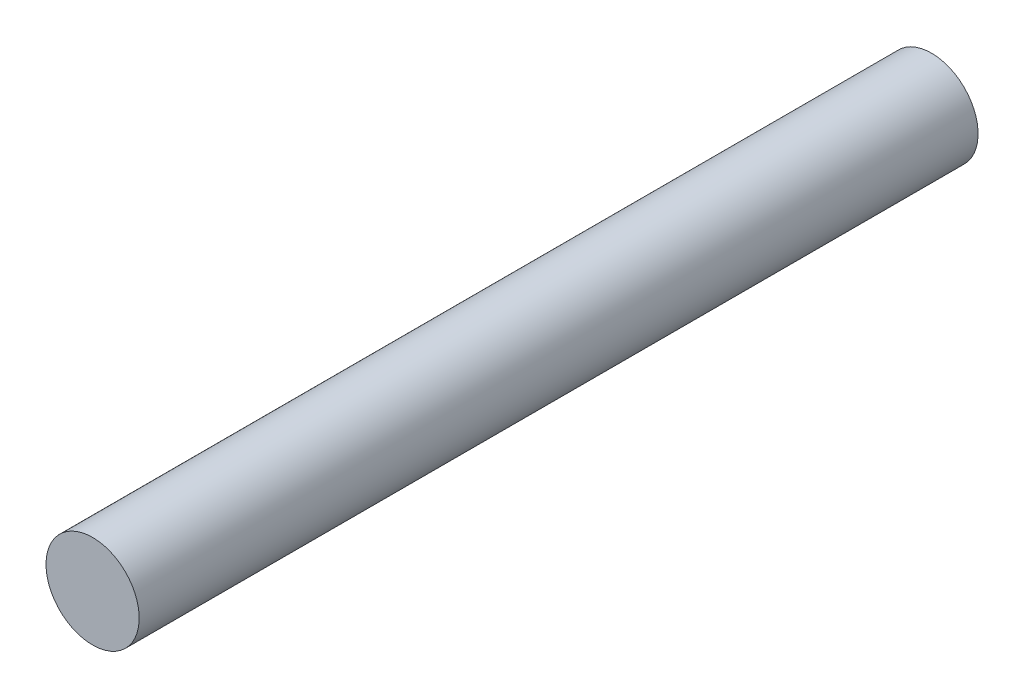
ISO-10303-21;
HEADER;
FILE_DESCRIPTION(('STEP AP214'),'2;1');
FILE_NAME('part.step','',(''),(''),'','','');
FILE_SCHEMA(('AUTOMOTIVE_DESIGN { 1 0 10303 214 1 1 1 1 }'));
ENDSEC;
DATA;
#1=APPLICATION_CONTEXT('core data for automotive mechanical design processes');
#2=APPLICATION_PROTOCOL_DEFINITION('international standard','automotive_design',2000,#1);
#3=PRODUCT_CONTEXT('',#1,'mechanical');
#4=PRODUCT('Part','Part','',(#3));
#5=PRODUCT_RELATED_PRODUCT_CATEGORY('part','',(#4));
#6=PRODUCT_DEFINITION_FORMATION('','',#4);
#7=PRODUCT_DEFINITION_CONTEXT('part definition',#1,'design');
#8=PRODUCT_DEFINITION('design','',#6,#7);
#9=PRODUCT_DEFINITION_SHAPE('','',#8);
#10=(LENGTH_UNIT() NAMED_UNIT(*) SI_UNIT(.MILLI.,.METRE.));
#11=(NAMED_UNIT(*) PLANE_ANGLE_UNIT() SI_UNIT($,.RADIAN.));
#12=(NAMED_UNIT(*) SI_UNIT($,.STERADIAN.) SOLID_ANGLE_UNIT());
#13=UNCERTAINTY_MEASURE_WITH_UNIT(LENGTH_MEASURE(1.E-05),#10,'distance_accuracy_value','');
#14=(GEOMETRIC_REPRESENTATION_CONTEXT(3) GLOBAL_UNCERTAINTY_ASSIGNED_CONTEXT((#13)) GLOBAL_UNIT_ASSIGNED_CONTEXT((#10,
#11,#12)) REPRESENTATION_CONTEXT('',''));
#15=CARTESIAN_POINT('',(0.,0.,0.));
#16=DIRECTION('',(0.,0.,1.));
#17=DIRECTION('',(1.,0.,0.));
#18=AXIS2_PLACEMENT_3D('',#15,#16,#17);
#19=CARTESIAN_POINT('',(3.12564908296054,22.5532728919546,45.));
#20=DIRECTION('',(0.,0.,-1.));
#21=DIRECTION('',(-1.,0.,0.));
#22=AXIS2_PLACEMENT_3D('',#19,#20,#21);
#23=CYLINDRICAL_SURFACE('',#22,2.5);
#24=CARTESIAN_POINT('',(3.12564908296054,22.5532728919546,45.));
#25=DIRECTION('',(0.,0.,1.));
#26=DIRECTION('',(1.,0.,0.));
#27=AXIS2_PLACEMENT_3D('',#24,#25,#26);
#28=CIRCLE('',#27,2.5);
#29=CARTESIAN_POINT('',(0.625649082960535,22.5532728919546,45.));
#30=VERTEX_POINT('',#29);
#31=EDGE_CURVE('E10',#30,#30,#28,.T.);
#32=CARTESIAN_POINT('',(3.12564908296054,22.5532728919546,0.));
#33=DIRECTION('',(0.,0.,1.));
#34=DIRECTION('',(1.,0.,0.));
#35=AXIS2_PLACEMENT_3D('',#32,#33,#34);
#36=CIRCLE('',#35,2.5);
#37=CARTESIAN_POINT('',(0.625649082960535,22.5532728919546,0.));
#38=VERTEX_POINT('',#37);
#39=EDGE_CURVE('E34',#38,#38,#36,.T.);
#40=CARTESIAN_POINT('',(0.625649082960535,22.5532728919546,45.));
#41=CARTESIAN_POINT('',(0.625649082960535,22.5532728919546,44.53125));
#42=CARTESIAN_POINT('',(0.625649082960535,22.5532728919546,44.0625));
#43=CARTESIAN_POINT('',(0.625649082960535,22.5532728919546,43.125));
#44=CARTESIAN_POINT('',(0.625649082960535,22.5532728919546,42.65625));
#45=CARTESIAN_POINT('',(0.625649082960535,22.5532728919546,41.71875));
#46=CARTESIAN_POINT('',(0.625649082960535,22.5532728919546,41.25));
#47=CARTESIAN_POINT('',(0.625649082960535,22.5532728919546,40.3125));
#48=CARTESIAN_POINT('',(0.625649082960535,22.5532728919546,39.84375));
#49=CARTESIAN_POINT('',(0.625649082960535,22.5532728919546,38.90625));
#50=CARTESIAN_POINT('',(0.625649082960535,22.5532728919546,38.4375));
#51=CARTESIAN_POINT('',(0.625649082960535,22.5532728919546,37.5));
#52=CARTESIAN_POINT('',(0.625649082960535,22.5532728919546,37.03125));
#53=CARTESIAN_POINT('',(0.625649082960535,22.5532728919546,36.09375));
#54=CARTESIAN_POINT('',(0.625649082960535,22.5532728919546,35.625));
#55=CARTESIAN_POINT('',(0.625649082960535,22.5532728919546,34.6875));
#56=CARTESIAN_POINT('',(0.625649082960535,22.5532728919546,34.21875));
#57=CARTESIAN_POINT('',(0.625649082960535,22.5532728919546,33.28125));
#58=CARTESIAN_POINT('',(0.625649082960535,22.5532728919546,32.8125));
#59=CARTESIAN_POINT('',(0.625649082960535,22.5532728919546,31.875));
#60=CARTESIAN_POINT('',(0.625649082960535,22.5532728919546,31.40625));
#61=CARTESIAN_POINT('',(0.625649082960535,22.5532728919546,30.46875));
#62=CARTESIAN_POINT('',(0.625649082960535,22.5532728919546,30.));
#63=CARTESIAN_POINT('',(0.625649082960535,22.5532728919546,29.0625));
#64=CARTESIAN_POINT('',(0.625649082960535,22.5532728919546,28.59375));
#65=CARTESIAN_POINT('',(0.625649082960535,22.5532728919546,27.65625));
#66=CARTESIAN_POINT('',(0.625649082960535,22.5532728919546,27.1875));
#67=CARTESIAN_POINT('',(0.625649082960535,22.5532728919546,26.25));
#68=CARTESIAN_POINT('',(0.625649082960535,22.5532728919546,25.78125));
#69=CARTESIAN_POINT('',(0.625649082960535,22.5532728919546,24.84375));
#70=CARTESIAN_POINT('',(0.625649082960535,22.5532728919546,24.375));
#71=CARTESIAN_POINT('',(0.625649082960535,22.5532728919546,23.4375));
#72=CARTESIAN_POINT('',(0.625649082960535,22.5532728919546,22.96875));
#73=CARTESIAN_POINT('',(0.625649082960535,22.5532728919546,22.03125));
#74=CARTESIAN_POINT('',(0.625649082960535,22.5532728919546,21.5625));
#75=CARTESIAN_POINT('',(0.625649082960535,22.5532728919546,20.625));
#76=CARTESIAN_POINT('',(0.625649082960535,22.5532728919546,20.15625));
#77=CARTESIAN_POINT('',(0.625649082960535,22.5532728919546,19.21875));
#78=CARTESIAN_POINT('',(0.625649082960535,22.5532728919546,18.75));
#79=CARTESIAN_POINT('',(0.625649082960535,22.5532728919546,17.8125));
#80=CARTESIAN_POINT('',(0.625649082960535,22.5532728919546,17.34375));
#81=CARTESIAN_POINT('',(0.625649082960535,22.5532728919546,16.40625));
#82=CARTESIAN_POINT('',(0.625649082960535,22.5532728919546,15.9375));
#83=CARTESIAN_POINT('',(0.625649082960535,22.5532728919546,15.));
#84=CARTESIAN_POINT('',(0.625649082960535,22.5532728919546,14.53125));
#85=CARTESIAN_POINT('',(0.625649082960535,22.5532728919546,13.59375));
#86=CARTESIAN_POINT('',(0.625649082960535,22.5532728919546,13.125));
#87=CARTESIAN_POINT('',(0.625649082960535,22.5532728919546,12.1875));
#88=CARTESIAN_POINT('',(0.625649082960535,22.5532728919546,11.71875));
#89=CARTESIAN_POINT('',(0.625649082960535,22.5532728919546,10.78125));
#90=CARTESIAN_POINT('',(0.625649082960535,22.5532728919546,10.3125));
#91=CARTESIAN_POINT('',(0.625649082960535,22.5532728919546,9.37499999999999));
#92=CARTESIAN_POINT('',(0.625649082960535,22.5532728919546,8.90624999999999));
#93=CARTESIAN_POINT('',(0.625649082960535,22.5532728919546,7.96874999999999));
#94=CARTESIAN_POINT('',(0.625649082960535,22.5532728919546,7.5));
#95=CARTESIAN_POINT('',(0.625649082960535,22.5532728919546,6.56249999999999));
#96=CARTESIAN_POINT('',(0.625649082960535,22.5532728919546,6.09374999999999));
#97=CARTESIAN_POINT('',(0.625649082960535,22.5532728919546,5.15624999999999));
#98=CARTESIAN_POINT('',(0.625649082960535,22.5532728919546,4.68749999999999));
#99=CARTESIAN_POINT('',(0.625649082960535,22.5532728919546,3.74999999999999));
#100=CARTESIAN_POINT('',(0.625649082960535,22.5532728919546,3.28124999999999));
#101=CARTESIAN_POINT('',(0.625649082960535,22.5532728919546,2.34374999999999));
#102=CARTESIAN_POINT('',(0.625649082960535,22.5532728919546,1.87499999999999));
#103=CARTESIAN_POINT('',(0.625649082960535,22.5532728919546,0.937499999999992));
#104=CARTESIAN_POINT('',(0.625649082960535,22.5532728919546,0.468749999999993));
#105=CARTESIAN_POINT('',(0.625649082960535,22.5532728919546,0.));
#106=B_SPLINE_CURVE_WITH_KNOTS('',3,(#40,#41,#42,#43,#44,#45,#46,#47,#48,#49,#50,#51,#52,#53,
#54,#55,#56,#57,#58,#59,#60,#61,#62,#63,#64,#65,#66,#67,#68,#69,#70,#71,#72,#73,#74,#75,#76,#77,
#78,#79,#80,#81,#82,#83,#84,#85,#86,#87,#88,#89,#90,#91,#92,#93,#94,#95,#96,#97,#98,#99,#100,
#101,#102,#103,#104,#105),.UNSPECIFIED.,.F.,.F.,(4,2,2,2,2,2,2,2,2,2,2,2,2,2,2,2,2,2,2,2,2,2,2,
2,2,2,2,2,2,2,2,2,4),(0.,1.40625,2.8125,4.21874999999999,5.625,7.03125,8.43749999999999,9.84375,
11.25,12.65625,14.0625,15.46875,16.875,18.28125,19.6875,21.09375,22.5,23.90625,25.3125,26.71875,
28.125,29.53125,30.9375,32.34375,33.75,35.15625,36.5625,37.96875,39.375,40.78125,42.1875,
43.59375,45.),.UNSPECIFIED.);
#107=EDGE_CURVE('BSEAM31',#30,#38,#106,.T.);
#108=ORIENTED_EDGE('',*,*,#31,.F.);
#109=ORIENTED_EDGE('',*,*,#39,.T.);
#110=ORIENTED_EDGE('',*,*,#107,.T.);
#111=ORIENTED_EDGE('',*,*,#107,.F.);
#112=EDGE_LOOP('',(#108,#110,#109,#111));
#113=FACE_BOUND('',#112,.T.);
#114=ADVANCED_FACE('F31',(#113),#23,.T.);
#115=CARTESIAN_POINT('',(3.12564908296054,22.5532728919546,45.));
#116=DIRECTION('',(0.,0.,1.));
#117=DIRECTION('',(1.,0.,0.));
#118=AXIS2_PLACEMENT_3D('',#115,#116,#117);
#119=PLANE('',#118);
#120=ORIENTED_EDGE('',*,*,#31,.T.);
#121=EDGE_LOOP('',(#120));
#122=FACE_BOUND('',#121,.T.);
#123=ADVANCED_FACE('F46',(#122),#119,.T.);
#124=CARTESIAN_POINT('',(3.12564908296054,22.5532728919546,0.));
#125=DIRECTION('',(0.,0.,1.));
#126=DIRECTION('',(1.,0.,0.));
#127=AXIS2_PLACEMENT_3D('',#124,#125,#126);
#128=PLANE('',#127);
#129=ORIENTED_EDGE('',*,*,#39,.F.);
#130=EDGE_LOOP('',(#129));
#131=FACE_BOUND('',#130,.T.);
#132=ADVANCED_FACE('F44',(#131),#128,.F.);
#133=CLOSED_SHELL('',(#114,#123,#132));
#134=MANIFOLD_SOLID_BREP('B2',#133);
#135=ADVANCED_BREP_SHAPE_REPRESENTATION('',(#18,#134),#14);
#136=SHAPE_DEFINITION_REPRESENTATION(#9,#135);
ENDSEC;
END-ISO-10303-21;
